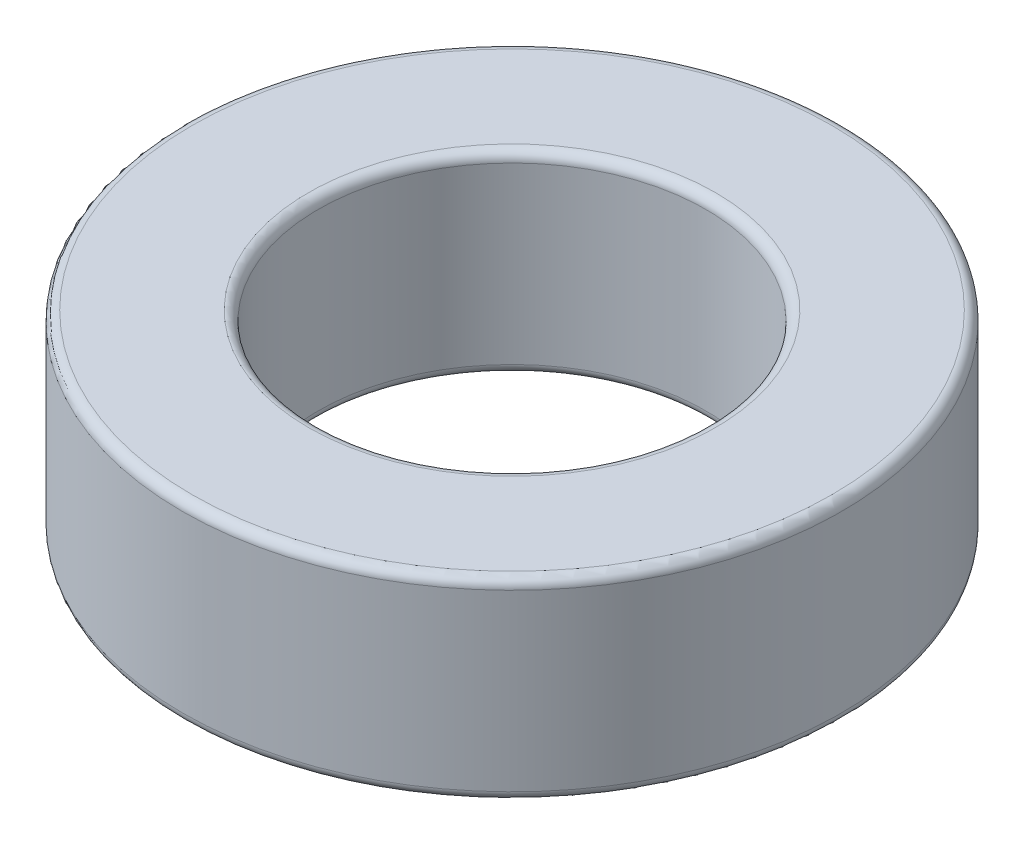
ISO-10303-21;
HEADER;
FILE_DESCRIPTION(('STEP AP214'),'2;1');
FILE_NAME('part.step','',(''),(''),'','','');
FILE_SCHEMA(('AUTOMOTIVE_DESIGN { 1 0 10303 214 1 1 1 1 }'));
ENDSEC;
DATA;
#1=APPLICATION_CONTEXT('core data for automotive mechanical design processes');
#2=APPLICATION_PROTOCOL_DEFINITION('international standard','automotive_design',2000,#1);
#3=PRODUCT_CONTEXT('',#1,'mechanical');
#4=PRODUCT('Part','Part','',(#3));
#5=PRODUCT_RELATED_PRODUCT_CATEGORY('part','',(#4));
#6=PRODUCT_DEFINITION_FORMATION('','',#4);
#7=PRODUCT_DEFINITION_CONTEXT('part definition',#1,'design');
#8=PRODUCT_DEFINITION('design','',#6,#7);
#9=PRODUCT_DEFINITION_SHAPE('','',#8);
#10=(LENGTH_UNIT() NAMED_UNIT(*) SI_UNIT(.MILLI.,.METRE.));
#11=(NAMED_UNIT(*) PLANE_ANGLE_UNIT() SI_UNIT($,.RADIAN.));
#12=(NAMED_UNIT(*) SI_UNIT($,.STERADIAN.) SOLID_ANGLE_UNIT());
#13=UNCERTAINTY_MEASURE_WITH_UNIT(LENGTH_MEASURE(1.E-05),#10,'distance_accuracy_value','');
#14=(GEOMETRIC_REPRESENTATION_CONTEXT(3) GLOBAL_UNCERTAINTY_ASSIGNED_CONTEXT((#13)) GLOBAL_UNIT_ASSIGNED_CONTEXT((#10,
#11,#12)) REPRESENTATION_CONTEXT('',''));
#15=CARTESIAN_POINT('',(0.,0.,0.));
#16=DIRECTION('',(0.,0.,1.));
#17=DIRECTION('',(1.,0.,0.));
#18=AXIS2_PLACEMENT_3D('',#15,#16,#17);
#19=CARTESIAN_POINT('',(0.,5.,0.));
#20=DIRECTION('',(0.,1.,0.));
#21=DIRECTION('',(0.,0.,1.));
#22=AXIS2_PLACEMENT_3D('',#19,#20,#21);
#23=PLANE('',#22);
#24=CARTESIAN_POINT('',(0.,5.,0.));
#25=DIRECTION('',(0.,1.,0.));
#26=DIRECTION('',(0.,0.,1.));
#27=AXIS2_PLACEMENT_3D('',#24,#25,#26);
#28=CIRCLE('',#27,5.25);
#29=CARTESIAN_POINT('',(0.,5.,5.25));
#30=VERTEX_POINT('',#29);
#31=EDGE_CURVE('E50',#30,#30,#28,.F.);
#32=ORIENTED_EDGE('',*,*,#31,.T.);
#33=EDGE_LOOP('',(#32));
#34=FACE_BOUND('',#33,.T.);
#35=CARTESIAN_POINT('',(0.,5.,0.));
#36=DIRECTION('',(0.,1.,0.));
#37=DIRECTION('',(0.,0.,1.));
#38=AXIS2_PLACEMENT_3D('',#35,#36,#37);
#39=CIRCLE('',#38,8.25);
#40=CARTESIAN_POINT('',(0.,5.,8.25));
#41=VERTEX_POINT('',#40);
#42=EDGE_CURVE('E54',#41,#41,#39,.T.);
#43=ORIENTED_EDGE('',*,*,#42,.T.);
#44=EDGE_LOOP('',(#43));
#45=FACE_BOUND('',#44,.T.);
#46=ADVANCED_FACE('F39',(#34,#45),#23,.T.);
#47=CARTESIAN_POINT('',(0.,0.,0.));
#48=DIRECTION('',(0.,1.,0.));
#49=DIRECTION('',(0.,0.,1.));
#50=AXIS2_PLACEMENT_3D('',#47,#48,#49);
#51=PLANE('',#50);
#52=CARTESIAN_POINT('',(0.,0.,0.));
#53=DIRECTION('',(0.,1.,0.));
#54=DIRECTION('',(0.,0.,1.));
#55=AXIS2_PLACEMENT_3D('',#52,#53,#54);
#56=CIRCLE('',#55,5.25);
#57=CARTESIAN_POINT('',(0.,0.,5.25));
#58=VERTEX_POINT('',#57);
#59=EDGE_CURVE('E65',#58,#58,#56,.T.);
#60=ORIENTED_EDGE('',*,*,#59,.T.);
#61=EDGE_LOOP('',(#60));
#62=FACE_BOUND('',#61,.T.);
#63=CARTESIAN_POINT('',(0.,0.,0.));
#64=DIRECTION('',(0.,1.,0.));
#65=DIRECTION('',(0.,0.,1.));
#66=AXIS2_PLACEMENT_3D('',#63,#64,#65);
#67=CIRCLE('',#66,8.25);
#68=CARTESIAN_POINT('',(0.,0.,8.25));
#69=VERTEX_POINT('',#68);
#70=EDGE_CURVE('E68',#69,#69,#67,.F.);
#71=ORIENTED_EDGE('',*,*,#70,.T.);
#72=EDGE_LOOP('',(#71));
#73=FACE_BOUND('',#72,.T.);
#74=ADVANCED_FACE('F72',(#62,#73),#51,.F.);
#75=CARTESIAN_POINT('',(0.,5.,0.));
#76=DIRECTION('',(0.,-1.,0.));
#77=DIRECTION('',(0.,0.,-1.));
#78=AXIS2_PLACEMENT_3D('',#75,#76,#77);
#79=CYLINDRICAL_SURFACE('',#78,8.5);
#80=CARTESIAN_POINT('',(0.,0.25,0.));
#81=DIRECTION('',(0.,1.,0.));
#82=DIRECTION('',(0.,0.,1.));
#83=AXIS2_PLACEMENT_3D('',#80,#81,#82);
#84=CIRCLE('',#83,8.5);
#85=CARTESIAN_POINT('',(0.,0.25,8.5));
#86=VERTEX_POINT('',#85);
#87=EDGE_CURVE('E10',#86,#86,#84,.T.);
#88=ORIENTED_EDGE('',*,*,#87,.T.);
#89=EDGE_LOOP('',(#88));
#90=FACE_BOUND('',#89,.T.);
#91=CARTESIAN_POINT('',(0.,4.75,0.));
#92=DIRECTION('',(0.,1.,0.));
#93=DIRECTION('',(0.,0.,1.));
#94=AXIS2_PLACEMENT_3D('',#91,#92,#93);
#95=CIRCLE('',#94,8.5);
#96=CARTESIAN_POINT('',(0.,4.75,8.5));
#97=VERTEX_POINT('',#96);
#98=EDGE_CURVE('E46',#97,#97,#95,.F.);
#99=ORIENTED_EDGE('',*,*,#98,.T.);
#100=EDGE_LOOP('',(#99));
#101=FACE_BOUND('',#100,.T.);
#102=ADVANCED_FACE('F92',(#90,#101),#79,.T.);
#103=CARTESIAN_POINT('',(0.,5.,0.));
#104=DIRECTION('',(0.,-1.,0.));
#105=DIRECTION('',(0.,0.,-1.));
#106=AXIS2_PLACEMENT_3D('',#103,#104,#105);
#107=CYLINDRICAL_SURFACE('',#106,5.);
#108=CARTESIAN_POINT('',(0.,0.25,0.));
#109=DIRECTION('',(0.,1.,0.));
#110=DIRECTION('',(0.,0.,1.));
#111=AXIS2_PLACEMENT_3D('',#108,#109,#110);
#112=CIRCLE('',#111,5.);
#113=CARTESIAN_POINT('',(0.,0.25,5.));
#114=VERTEX_POINT('',#113);
#115=EDGE_CURVE('E59',#114,#114,#112,.F.);
#116=ORIENTED_EDGE('',*,*,#115,.T.);
#117=EDGE_LOOP('',(#116));
#118=FACE_BOUND('',#117,.T.);
#119=CARTESIAN_POINT('',(0.,4.75,0.));
#120=DIRECTION('',(0.,1.,0.));
#121=DIRECTION('',(0.,0.,1.));
#122=AXIS2_PLACEMENT_3D('',#119,#120,#121);
#123=CIRCLE('',#122,5.);
#124=CARTESIAN_POINT('',(0.,4.75,5.));
#125=VERTEX_POINT('',#124);
#126=EDGE_CURVE('E62',#125,#125,#123,.T.);
#127=ORIENTED_EDGE('',*,*,#126,.T.);
#128=EDGE_LOOP('',(#127));
#129=FACE_BOUND('',#128,.T.);
#130=ADVANCED_FACE('F97',(#118,#129),#107,.F.);
#131=CARTESIAN_POINT('',(0.,0.25,0.));
#132=DIRECTION('',(0.,1.,0.));
#133=DIRECTION('',(0.,0.,1.));
#134=AXIS2_PLACEMENT_3D('',#131,#132,#133);
#135=TOROIDAL_SURFACE('',#134,5.25,0.25);
#136=ORIENTED_EDGE('',*,*,#115,.F.);
#137=EDGE_LOOP('',(#136));
#138=FACE_BOUND('',#137,.T.);
#139=ORIENTED_EDGE('',*,*,#59,.F.);
#140=EDGE_LOOP('',(#139));
#141=FACE_BOUND('',#140,.T.);
#142=ADVANCED_FACE('F83',(#138,#141),#135,.T.);
#143=CARTESIAN_POINT('',(0.,4.75,0.));
#144=DIRECTION('',(0.,1.,0.));
#145=DIRECTION('',(0.,0.,1.));
#146=AXIS2_PLACEMENT_3D('',#143,#144,#145);
#147=TOROIDAL_SURFACE('',#146,5.25,0.25);
#148=ORIENTED_EDGE('',*,*,#31,.F.);
#149=EDGE_LOOP('',(#148));
#150=FACE_BOUND('',#149,.T.);
#151=ORIENTED_EDGE('',*,*,#126,.F.);
#152=EDGE_LOOP('',(#151));
#153=FACE_BOUND('',#152,.T.);
#154=ADVANCED_FACE('F77',(#150,#153),#147,.T.);
#155=CARTESIAN_POINT('',(0.,0.25,0.));
#156=DIRECTION('',(0.,1.,0.));
#157=DIRECTION('',(0.,0.,1.));
#158=AXIS2_PLACEMENT_3D('',#155,#156,#157);
#159=TOROIDAL_SURFACE('',#158,8.25,0.25);
#160=ORIENTED_EDGE('',*,*,#70,.F.);
#161=EDGE_LOOP('',(#160));
#162=FACE_BOUND('',#161,.T.);
#163=ORIENTED_EDGE('',*,*,#87,.F.);
#164=EDGE_LOOP('',(#163));
#165=FACE_BOUND('',#164,.T.);
#166=ADVANCED_FACE('F74',(#162,#165),#159,.T.);
#167=CARTESIAN_POINT('',(0.,4.75,0.));
#168=DIRECTION('',(0.,1.,0.));
#169=DIRECTION('',(0.,0.,1.));
#170=AXIS2_PLACEMENT_3D('',#167,#168,#169);
#171=TOROIDAL_SURFACE('',#170,8.25,0.25);
#172=ORIENTED_EDGE('',*,*,#98,.F.);
#173=EDGE_LOOP('',(#172));
#174=FACE_BOUND('',#173,.T.);
#175=ORIENTED_EDGE('',*,*,#42,.F.);
#176=EDGE_LOOP('',(#175));
#177=FACE_BOUND('',#176,.T.);
#178=ADVANCED_FACE('F41',(#174,#177),#171,.T.);
#179=CLOSED_SHELL('',(#46,#74,#102,#130,#142,#154,#166,#178));
#180=MANIFOLD_SOLID_BREP('B2',#179);
#181=ADVANCED_BREP_SHAPE_REPRESENTATION('',(#18,#180),#14);
#182=SHAPE_DEFINITION_REPRESENTATION(#9,#181);
ENDSEC;
END-ISO-10303-21;
